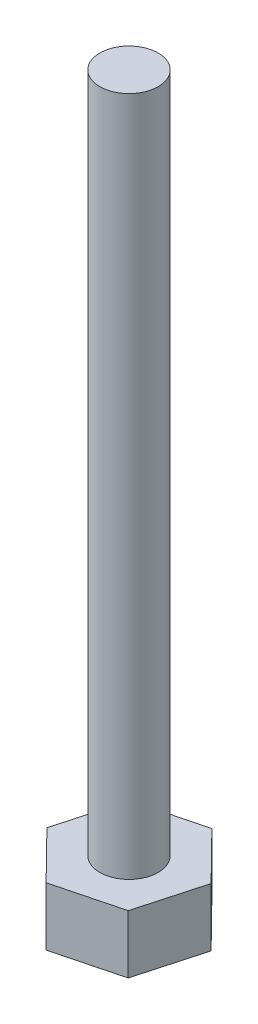
ISO-10303-21;
HEADER;
FILE_DESCRIPTION(('STEP AP214'),'2;1');
FILE_NAME('part.step','',(''),(''),'','','');
FILE_SCHEMA(('AUTOMOTIVE_DESIGN { 1 0 10303 214 1 1 1 1 }'));
ENDSEC;
DATA;
#1=APPLICATION_CONTEXT('core data for automotive mechanical design processes');
#2=APPLICATION_PROTOCOL_DEFINITION('international standard','automotive_design',2000,#1);
#3=PRODUCT_CONTEXT('',#1,'mechanical');
#4=PRODUCT('Part','Part','',(#3));
#5=PRODUCT_RELATED_PRODUCT_CATEGORY('part','',(#4));
#6=PRODUCT_DEFINITION_FORMATION('','',#4);
#7=PRODUCT_DEFINITION_CONTEXT('part definition',#1,'design');
#8=PRODUCT_DEFINITION('design','',#6,#7);
#9=PRODUCT_DEFINITION_SHAPE('','',#8);
#10=(LENGTH_UNIT() NAMED_UNIT(*) SI_UNIT(.MILLI.,.METRE.));
#11=(NAMED_UNIT(*) PLANE_ANGLE_UNIT() SI_UNIT($,.RADIAN.));
#12=(NAMED_UNIT(*) SI_UNIT($,.STERADIAN.) SOLID_ANGLE_UNIT());
#13=UNCERTAINTY_MEASURE_WITH_UNIT(LENGTH_MEASURE(1.E-05),#10,'distance_accuracy_value','');
#14=(GEOMETRIC_REPRESENTATION_CONTEXT(3) GLOBAL_UNCERTAINTY_ASSIGNED_CONTEXT((#13)) GLOBAL_UNIT_ASSIGNED_CONTEXT((#10,
#11,#12)) REPRESENTATION_CONTEXT('',''));
#15=CARTESIAN_POINT('',(0.,0.,0.));
#16=DIRECTION('',(0.,0.,1.));
#17=DIRECTION('',(1.,0.,0.));
#18=AXIS2_PLACEMENT_3D('',#15,#16,#17);
#19=CARTESIAN_POINT('',(-2.42916953405037,-35.,-2.46964276259573));
#20=DIRECTION('',(-0.250830155065879,0.,-0.968031111746739));
#21=DIRECTION('',(-0.968031111746739,0.,0.250830155065879));
#22=AXIS2_PLACEMENT_3D('',#19,#20,#21);
#23=PLANE('',#22);
#24=DIRECTION('',(0.968031111746739,0.,-0.250830155065879));
#25=VECTOR('',#24,1.);
#26=CARTESIAN_POINT('',(-2.42916953405037,-38.,-2.46964276259573));
#27=LINE('',#26,#25);
#28=CARTESIAN_POINT('',(-2.42916953405037,-38.,-2.46964276259573));
#29=VERTEX_POINT('',#28);
#30=CARTESIAN_POINT('',(0.924188603655103,-38.,-3.3385439078847));
#31=VERTEX_POINT('',#30);
#32=EDGE_CURVE('E120',#29,#31,#27,.T.);
#33=ORIENTED_EDGE('',*,*,#32,.F.);
#34=DIRECTION('',(0.,-1.,0.));
#35=VECTOR('',#34,1.);
#36=CARTESIAN_POINT('',(-2.42916953405037,-35.,-2.46964276259573));
#37=LINE('',#36,#35);
#38=CARTESIAN_POINT('',(-2.42916953405037,-35.,-2.46964276259573));
#39=VERTEX_POINT('',#38);
#40=EDGE_CURVE('E42',#39,#29,#37,.T.);
#41=ORIENTED_EDGE('',*,*,#40,.F.);
#42=DIRECTION('',(0.968031111746739,0.,-0.250830155065879));
#43=VECTOR('',#42,1.);
#44=CARTESIAN_POINT('',(-2.42916953405037,-35.,-2.46964276259573));
#45=LINE('',#44,#43);
#46=CARTESIAN_POINT('',(0.924188603655103,-35.,-3.3385439078847));
#47=VERTEX_POINT('',#46);
#48=EDGE_CURVE('E136',#39,#47,#45,.T.);
#49=ORIENTED_EDGE('',*,*,#48,.T.);
#50=DIRECTION('',(0.,-1.,0.));
#51=VECTOR('',#50,1.);
#52=CARTESIAN_POINT('',(0.924188603655103,-35.,-3.3385439078847));
#53=LINE('',#52,#51);
#54=EDGE_CURVE('E36',#47,#31,#53,.T.);
#55=ORIENTED_EDGE('',*,*,#54,.T.);
#56=EDGE_LOOP('',(#33,#41,#49,#55));
#57=FACE_BOUND('',#56,.T.);
#58=ADVANCED_FACE('F33',(#57),#23,.T.);
#59=CARTESIAN_POINT('',(-3.35335813770548,-35.,0.868901145288965));
#60=DIRECTION('',(-0.963754611959308,0.,-0.266790269551128));
#61=DIRECTION('',(-0.266790269551128,0.,0.963754611959308));
#62=AXIS2_PLACEMENT_3D('',#59,#60,#61);
#63=PLANE('',#62);
#64=DIRECTION('',(0.266790269551128,0.,-0.963754611959308));
#65=VECTOR('',#64,1.);
#66=CARTESIAN_POINT('',(-3.35335813770548,-38.,0.868901145288965));
#67=LINE('',#66,#65);
#68=CARTESIAN_POINT('',(-3.35335813770548,-38.,0.868901145288965));
#69=VERTEX_POINT('',#68);
#70=EDGE_CURVE('E133',#69,#29,#67,.T.);
#71=ORIENTED_EDGE('',*,*,#70,.F.);
#72=DIRECTION('',(0.,-1.,0.));
#73=VECTOR('',#72,1.);
#74=CARTESIAN_POINT('',(-3.35335813770548,-35.,0.868901145288965));
#75=LINE('',#74,#73);
#76=CARTESIAN_POINT('',(-3.35335813770548,-35.,0.868901145288965));
#77=VERTEX_POINT('',#76);
#78=EDGE_CURVE('E73',#77,#69,#75,.T.);
#79=ORIENTED_EDGE('',*,*,#78,.F.);
#80=DIRECTION('',(0.266790269551128,0.,-0.963754611959308));
#81=VECTOR('',#80,1.);
#82=CARTESIAN_POINT('',(-3.35335813770548,-35.,0.868901145288965));
#83=LINE('',#82,#81);
#84=EDGE_CURVE('E110',#77,#39,#83,.T.);
#85=ORIENTED_EDGE('',*,*,#84,.T.);
#86=ORIENTED_EDGE('',*,*,#40,.T.);
#87=EDGE_LOOP('',(#71,#79,#85,#86));
#88=FACE_BOUND('',#87,.T.);
#89=ADVANCED_FACE('F144',(#88),#63,.T.);
#90=CARTESIAN_POINT('',(-0.924188603655101,-35.,3.3385439078847));
#91=DIRECTION('',(-0.712924456893429,0.,0.701240842195611));
#92=DIRECTION('',(0.70124084219561,0.,0.712924456893429));
#93=AXIS2_PLACEMENT_3D('',#90,#91,#92);
#94=PLANE('',#93);
#95=DIRECTION('',(-0.70124084219561,0.,-0.712924456893429));
#96=VECTOR('',#95,1.);
#97=CARTESIAN_POINT('',(-0.924188603655101,-38.,3.3385439078847));
#98=LINE('',#97,#96);
#99=CARTESIAN_POINT('',(-0.924188603655101,-38.,3.3385439078847));
#100=VERTEX_POINT('',#99);
#101=EDGE_CURVE('E97',#100,#69,#98,.T.);
#102=ORIENTED_EDGE('',*,*,#101,.F.);
#103=DIRECTION('',(0.,-1.,0.));
#104=VECTOR('',#103,1.);
#105=CARTESIAN_POINT('',(-0.924188603655101,-35.,3.3385439078847));
#106=LINE('',#105,#104);
#107=CARTESIAN_POINT('',(-0.924188603655101,-35.,3.3385439078847));
#108=VERTEX_POINT('',#107);
#109=EDGE_CURVE('E92',#108,#100,#106,.T.);
#110=ORIENTED_EDGE('',*,*,#109,.F.);
#111=DIRECTION('',(-0.70124084219561,0.,-0.712924456893429));
#112=VECTOR('',#111,1.);
#113=CARTESIAN_POINT('',(-0.924188603655101,-35.,3.3385439078847));
#114=LINE('',#113,#112);
#115=EDGE_CURVE('E95',#108,#77,#114,.T.);
#116=ORIENTED_EDGE('',*,*,#115,.T.);
#117=ORIENTED_EDGE('',*,*,#78,.T.);
#118=EDGE_LOOP('',(#102,#110,#116,#117));
#119=FACE_BOUND('',#118,.T.);
#120=ADVANCED_FACE('F94',(#119),#94,.T.);
#121=CARTESIAN_POINT('',(2.42916953405037,-35.,2.46964276259573));
#122=DIRECTION('',(0.250830155065879,0.,0.968031111746739));
#123=DIRECTION('',(0.968031111746739,0.,-0.250830155065879));
#124=AXIS2_PLACEMENT_3D('',#121,#122,#123);
#125=PLANE('',#124);
#126=DIRECTION('',(-0.968031111746739,0.,0.250830155065879));
#127=VECTOR('',#126,1.);
#128=CARTESIAN_POINT('',(2.42916953405037,-38.,2.46964276259573));
#129=LINE('',#128,#127);
#130=CARTESIAN_POINT('',(2.42916953405037,-38.,2.46964276259573));
#131=VERTEX_POINT('',#130);
#132=EDGE_CURVE('E130',#131,#100,#129,.T.);
#133=ORIENTED_EDGE('',*,*,#132,.F.);
#134=DIRECTION('',(0.,-1.,0.));
#135=VECTOR('',#134,1.);
#136=CARTESIAN_POINT('',(2.42916953405037,-35.,2.46964276259573));
#137=LINE('',#136,#135);
#138=CARTESIAN_POINT('',(2.42916953405037,-35.,2.46964276259573));
#139=VERTEX_POINT('',#138);
#140=EDGE_CURVE('E102',#139,#131,#137,.T.);
#141=ORIENTED_EDGE('',*,*,#140,.F.);
#142=DIRECTION('',(-0.968031111746739,0.,0.250830155065879));
#143=VECTOR('',#142,1.);
#144=CARTESIAN_POINT('',(2.42916953405037,-35.,2.46964276259573));
#145=LINE('',#144,#143);
#146=EDGE_CURVE('E108',#139,#108,#145,.T.);
#147=ORIENTED_EDGE('',*,*,#146,.T.);
#148=ORIENTED_EDGE('',*,*,#109,.T.);
#149=EDGE_LOOP('',(#133,#141,#147,#148));
#150=FACE_BOUND('',#149,.T.);
#151=ADVANCED_FACE('F112',(#150),#125,.T.);
#152=CARTESIAN_POINT('',(3.35335813770548,-35.,-0.868901145288962));
#153=DIRECTION('',(0.963754611959308,0.,0.266790269551128));
#154=DIRECTION('',(0.266790269551128,0.,-0.963754611959308));
#155=AXIS2_PLACEMENT_3D('',#152,#153,#154);
#156=PLANE('',#155);
#157=DIRECTION('',(-0.266790269551128,0.,0.963754611959308));
#158=VECTOR('',#157,1.);
#159=CARTESIAN_POINT('',(3.35335813770548,-38.,-0.868901145288962));
#160=LINE('',#159,#158);
#161=CARTESIAN_POINT('',(3.35335813770548,-38.,-0.868901145288962));
#162=VERTEX_POINT('',#161);
#163=EDGE_CURVE('E127',#162,#131,#160,.T.);
#164=ORIENTED_EDGE('',*,*,#163,.F.);
#165=DIRECTION('',(0.,-1.,0.));
#166=VECTOR('',#165,1.);
#167=CARTESIAN_POINT('',(3.35335813770548,-35.,-0.868901145288962));
#168=LINE('',#167,#166);
#169=CARTESIAN_POINT('',(3.35335813770548,-35.,-0.868901145288962));
#170=VERTEX_POINT('',#169);
#171=EDGE_CURVE('E139',#170,#162,#168,.T.);
#172=ORIENTED_EDGE('',*,*,#171,.F.);
#173=DIRECTION('',(-0.266790269551128,0.,0.963754611959308));
#174=VECTOR('',#173,1.);
#175=CARTESIAN_POINT('',(3.35335813770548,-35.,-0.868901145288962));
#176=LINE('',#175,#174);
#177=EDGE_CURVE('E113',#170,#139,#176,.T.);
#178=ORIENTED_EDGE('',*,*,#177,.T.);
#179=ORIENTED_EDGE('',*,*,#140,.T.);
#180=EDGE_LOOP('',(#164,#172,#178,#179));
#181=FACE_BOUND('',#180,.T.);
#182=ADVANCED_FACE('F157',(#181),#156,.T.);
#183=CARTESIAN_POINT('',(0.924188603655103,-35.,-3.3385439078847));
#184=DIRECTION('',(0.71292445689343,0.,-0.70124084219561));
#185=DIRECTION('',(-0.70124084219561,0.,-0.71292445689343));
#186=AXIS2_PLACEMENT_3D('',#183,#184,#185);
#187=PLANE('',#186);
#188=DIRECTION('',(0.70124084219561,0.,0.71292445689343));
#189=VECTOR('',#188,1.);
#190=CARTESIAN_POINT('',(0.924188603655103,-38.,-3.3385439078847));
#191=LINE('',#190,#189);
#192=EDGE_CURVE('E123',#31,#162,#191,.T.);
#193=ORIENTED_EDGE('',*,*,#192,.F.);
#194=ORIENTED_EDGE('',*,*,#54,.F.);
#195=DIRECTION('',(0.70124084219561,0.,0.71292445689343));
#196=VECTOR('',#195,1.);
#197=CARTESIAN_POINT('',(0.924188603655103,-35.,-3.3385439078847));
#198=LINE('',#197,#196);
#199=EDGE_CURVE('E115',#47,#170,#198,.T.);
#200=ORIENTED_EDGE('',*,*,#199,.T.);
#201=ORIENTED_EDGE('',*,*,#171,.T.);
#202=EDGE_LOOP('',(#193,#194,#200,#201));
#203=FACE_BOUND('',#202,.T.);
#204=ADVANCED_FACE('F141',(#203),#187,.T.);
#205=CARTESIAN_POINT('',(0.,-35.,0.));
#206=DIRECTION('',(0.,-1.,0.));
#207=DIRECTION('',(0.,0.,-1.));
#208=AXIS2_PLACEMENT_3D('',#205,#206,#207);
#209=PLANE('',#208);
#210=CARTESIAN_POINT('',(0.,-35.,0.));
#211=DIRECTION('',(0.,1.,0.));
#212=DIRECTION('',(0.,0.,1.));
#213=AXIS2_PLACEMENT_3D('',#210,#211,#212);
#214=CIRCLE('',#213,1.5);
#215=CARTESIAN_POINT('',(0.,-35.,1.5));
#216=VERTEX_POINT('',#215);
#217=EDGE_CURVE('E11',#216,#216,#214,.T.);
#218=ORIENTED_EDGE('',*,*,#217,.F.);
#219=EDGE_LOOP('',(#218));
#220=FACE_BOUND('',#219,.T.);
#221=ORIENTED_EDGE('',*,*,#48,.F.);
#222=ORIENTED_EDGE('',*,*,#84,.F.);
#223=ORIENTED_EDGE('',*,*,#115,.F.);
#224=ORIENTED_EDGE('',*,*,#146,.F.);
#225=ORIENTED_EDGE('',*,*,#177,.F.);
#226=ORIENTED_EDGE('',*,*,#199,.F.);
#227=EDGE_LOOP('',(#221,#222,#223,#224,#225,#226));
#228=FACE_BOUND('',#227,.T.);
#229=ADVANCED_FACE('F106',(#220,#228),#209,.F.);
#230=CARTESIAN_POINT('',(0.,-38.,0.));
#231=DIRECTION('',(0.,-1.,0.));
#232=DIRECTION('',(0.,0.,-1.));
#233=AXIS2_PLACEMENT_3D('',#230,#231,#232);
#234=PLANE('',#233);
#235=ORIENTED_EDGE('',*,*,#32,.T.);
#236=ORIENTED_EDGE('',*,*,#192,.T.);
#237=ORIENTED_EDGE('',*,*,#163,.T.);
#238=ORIENTED_EDGE('',*,*,#132,.T.);
#239=ORIENTED_EDGE('',*,*,#101,.T.);
#240=ORIENTED_EDGE('',*,*,#70,.T.);
#241=EDGE_LOOP('',(#235,#236,#237,#238,#239,#240));
#242=FACE_BOUND('',#241,.T.);
#243=ADVANCED_FACE('F143',(#242),#234,.T.);
#244=CARTESIAN_POINT('',(0.,-35.,0.));
#245=DIRECTION('',(0.,1.,0.));
#246=DIRECTION('',(0.,0.,1.));
#247=AXIS2_PLACEMENT_3D('',#244,#245,#246);
#248=CYLINDRICAL_SURFACE('',#247,1.5);
#249=ORIENTED_EDGE('',*,*,#217,.T.);
#250=EDGE_LOOP('',(#249));
#251=FACE_BOUND('',#250,.T.);
#252=CARTESIAN_POINT('',(0.,0.,0.));
#253=DIRECTION('',(0.,1.,0.));
#254=DIRECTION('',(0.,0.,1.));
#255=AXIS2_PLACEMENT_3D('',#252,#253,#254);
#256=CIRCLE('',#255,1.5);
#257=CARTESIAN_POINT('',(0.,0.,1.5));
#258=VERTEX_POINT('',#257);
#259=EDGE_CURVE('E124',#258,#258,#256,.T.);
#260=ORIENTED_EDGE('',*,*,#259,.F.);
#261=EDGE_LOOP('',(#260));
#262=FACE_BOUND('',#261,.T.);
#263=ADVANCED_FACE('F168',(#251,#262),#248,.T.);
#264=CARTESIAN_POINT('',(0.,0.,0.));
#265=DIRECTION('',(0.,1.,0.));
#266=DIRECTION('',(0.,0.,1.));
#267=AXIS2_PLACEMENT_3D('',#264,#265,#266);
#268=PLANE('',#267);
#269=ORIENTED_EDGE('',*,*,#259,.T.);
#270=EDGE_LOOP('',(#269));
#271=FACE_BOUND('',#270,.T.);
#272=ADVANCED_FACE('F173',(#271),#268,.T.);
#273=CLOSED_SHELL('',(#58,#89,#120,#151,#182,#204,#229,#243,#263,#272));
#274=MANIFOLD_SOLID_BREP('B2',#273);
#275=ADVANCED_BREP_SHAPE_REPRESENTATION('',(#18,#274),#14);
#276=SHAPE_DEFINITION_REPRESENTATION(#9,#275);
ENDSEC;
END-ISO-10303-21;
